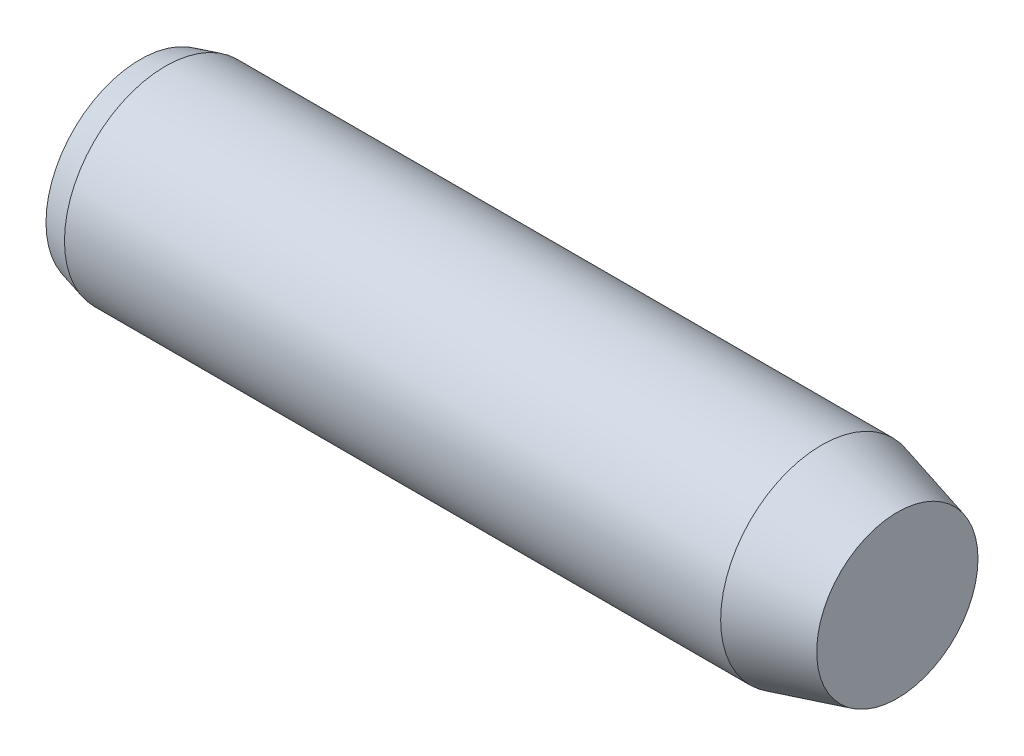
ISO-10303-21;
HEADER;
FILE_DESCRIPTION(('STEP AP214'),'2;1');
FILE_NAME('part.step','',(''),(''),'','','');
FILE_SCHEMA(('AUTOMOTIVE_DESIGN { 1 0 10303 214 1 1 1 1 }'));
ENDSEC;
DATA;
#1=APPLICATION_CONTEXT('core data for automotive mechanical design processes');
#2=APPLICATION_PROTOCOL_DEFINITION('international standard','automotive_design',2000,#1);
#3=PRODUCT_CONTEXT('',#1,'mechanical');
#4=PRODUCT('Part','Part','',(#3));
#5=PRODUCT_RELATED_PRODUCT_CATEGORY('part','',(#4));
#6=PRODUCT_DEFINITION_FORMATION('','',#4);
#7=PRODUCT_DEFINITION_CONTEXT('part definition',#1,'design');
#8=PRODUCT_DEFINITION('design','',#6,#7);
#9=PRODUCT_DEFINITION_SHAPE('','',#8);
#10=(LENGTH_UNIT() NAMED_UNIT(*) SI_UNIT(.MILLI.,.METRE.));
#11=(NAMED_UNIT(*) PLANE_ANGLE_UNIT() SI_UNIT($,.RADIAN.));
#12=(NAMED_UNIT(*) SI_UNIT($,.STERADIAN.) SOLID_ANGLE_UNIT());
#13=UNCERTAINTY_MEASURE_WITH_UNIT(LENGTH_MEASURE(1.E-05),#10,'distance_accuracy_value','');
#14=(GEOMETRIC_REPRESENTATION_CONTEXT(3) GLOBAL_UNCERTAINTY_ASSIGNED_CONTEXT((#13)) GLOBAL_UNIT_ASSIGNED_CONTEXT((#10,
#11,#12)) REPRESENTATION_CONTEXT('',''));
#15=CARTESIAN_POINT('',(0.,0.,0.));
#16=DIRECTION('',(0.,0.,1.));
#17=DIRECTION('',(1.,0.,0.));
#18=AXIS2_PLACEMENT_3D('',#15,#16,#17);
#19=CARTESIAN_POINT('',(-10.,0.,0.));
#20=DIRECTION('',(1.,0.,0.));
#21=DIRECTION('',(0.,0.,-1.00000000000001));
#22=AXIS2_PLACEMENT_3D('',#19,#20,#21);
#23=PLANE('',#22);
#24=CARTESIAN_POINT('',(-10.,0.,0.));
#25=DIRECTION('',(1.,0.,0.));
#26=DIRECTION('',(0.,0.,-1.00000000000001));
#27=AXIS2_PLACEMENT_3D('',#24,#25,#26);
#28=CIRCLE('',#27,1.86602540378444);
#29=CARTESIAN_POINT('',(-10.,0.,-1.86602540378445));
#30=VERTEX_POINT('',#29);
#31=EDGE_CURVE('E50',#30,#30,#28,.F.);
#32=ORIENTED_EDGE('',*,*,#31,.T.);
#33=EDGE_LOOP('',(#32));
#34=FACE_BOUND('',#33,.T.);
#35=ADVANCED_FACE('F43',(#34),#23,.F.);
#36=CARTESIAN_POINT('',(5.,0.,0.));
#37=DIRECTION('',(1.,0.,0.));
#38=DIRECTION('',(0.,0.,-1.00000000000001));
#39=AXIS2_PLACEMENT_3D('',#36,#37,#38);
#40=CYLINDRICAL_SURFACE('',#39,2.);
#41=CARTESIAN_POINT('',(-9.49999999999999,0.,0.));
#42=DIRECTION('',(1.,0.,0.));
#43=DIRECTION('',(0.,0.,-1.00000000000001));
#44=AXIS2_PLACEMENT_3D('',#41,#42,#43);
#45=CIRCLE('',#44,2.);
#46=CARTESIAN_POINT('',(-9.49999999999999,0.,-2.00000000000001));
#47=VERTEX_POINT('',#46);
#48=EDGE_CURVE('E12',#47,#47,#45,.T.);
#49=ORIENTED_EDGE('',*,*,#48,.T.);
#50=EDGE_LOOP('',(#49));
#51=FACE_BOUND('',#50,.T.);
#52=CARTESIAN_POINT('',(3.5,0.,0.));
#53=DIRECTION('',(1.,0.,0.));
#54=DIRECTION('',(0.,0.,-1.00000000000001));
#55=AXIS2_PLACEMENT_3D('',#52,#53,#54);
#56=CIRCLE('',#55,2.);
#57=CARTESIAN_POINT('',(3.5,0.,-2.00000000000001));
#58=VERTEX_POINT('',#57);
#59=EDGE_CURVE('E54',#58,#58,#56,.T.);
#60=ORIENTED_EDGE('',*,*,#59,.F.);
#61=EDGE_LOOP('',(#60));
#62=FACE_BOUND('',#61,.T.);
#63=ADVANCED_FACE('F69',(#51,#62),#40,.T.);
#64=CARTESIAN_POINT('',(3.5,0.,0.));
#65=DIRECTION('',(-1.,0.,0.));
#66=DIRECTION('',(0.,0.,1.00000000000001));
#67=AXIS2_PLACEMENT_3D('',#64,#65,#66);
#68=CONICAL_SURFACE('',#67,2.,0.261799387799149);
#69=CARTESIAN_POINT('',(5.,0.,0.));
#70=DIRECTION('',(1.,0.,0.));
#71=DIRECTION('',(0.,0.,-1.00000000000001));
#72=AXIS2_PLACEMENT_3D('',#69,#70,#71);
#73=CIRCLE('',#72,1.59807621135332);
#74=CARTESIAN_POINT('',(5.,0.,-1.59807621135332));
#75=VERTEX_POINT('',#74);
#76=EDGE_CURVE('E58',#75,#75,#73,.T.);
#77=ORIENTED_EDGE('',*,*,#76,.F.);
#78=EDGE_LOOP('',(#77));
#79=FACE_BOUND('',#78,.T.);
#80=ORIENTED_EDGE('',*,*,#59,.T.);
#81=EDGE_LOOP('',(#80));
#82=FACE_BOUND('',#81,.T.);
#83=ADVANCED_FACE('F66',(#79,#82),#68,.T.);
#84=CARTESIAN_POINT('',(5.,1.59807621135331,0.));
#85=DIRECTION('',(-1.,0.,0.));
#86=DIRECTION('',(0.,0.,1.00000000000001));
#87=AXIS2_PLACEMENT_3D('',#84,#85,#86);
#88=PLANE('',#87);
#89=ORIENTED_EDGE('',*,*,#76,.T.);
#90=EDGE_LOOP('',(#89));
#91=FACE_BOUND('',#90,.T.);
#92=ADVANCED_FACE('F64',(#91),#88,.F.);
#93=CARTESIAN_POINT('',(-9.99999999999999,0.,0.));
#94=DIRECTION('',(1.,0.,0.));
#95=DIRECTION('',(0.,0.,-1.00000000000001));
#96=AXIS2_PLACEMENT_3D('',#93,#94,#95);
#97=CONICAL_SURFACE('',#96,1.86602540378444,0.261799387799148);
#98=ORIENTED_EDGE('',*,*,#48,.F.);
#99=EDGE_LOOP('',(#98));
#100=FACE_BOUND('',#99,.T.);
#101=ORIENTED_EDGE('',*,*,#31,.F.);
#102=EDGE_LOOP('',(#101));
#103=FACE_BOUND('',#102,.T.);
#104=ADVANCED_FACE('F45',(#100,#103),#97,.T.);
#105=CLOSED_SHELL('',(#35,#63,#83,#92,#104));
#106=MANIFOLD_SOLID_BREP('B2',#105);
#107=ADVANCED_BREP_SHAPE_REPRESENTATION('',(#18,#106),#14);
#108=SHAPE_DEFINITION_REPRESENTATION(#9,#107);
ENDSEC;
END-ISO-10303-21;
